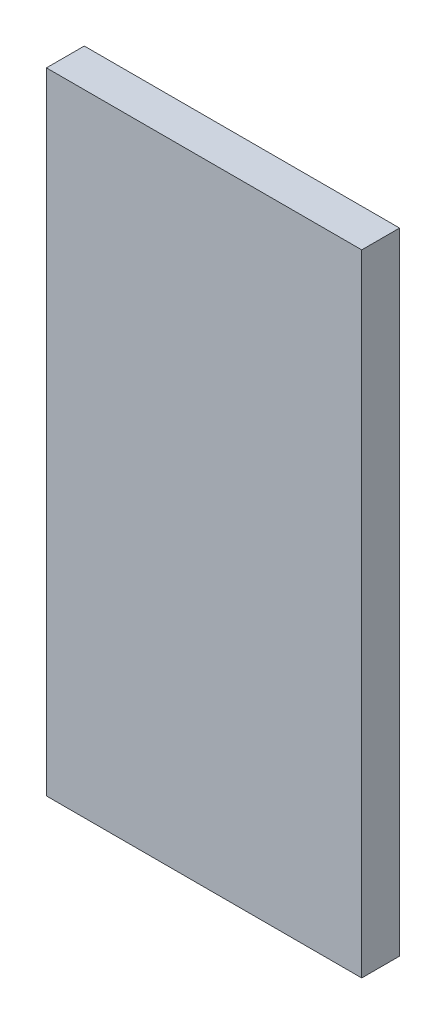
ISO-10303-21;
HEADER;
FILE_DESCRIPTION(('STEP AP214'),'2;1');
FILE_NAME('part.step','',(''),(''),'','','');
FILE_SCHEMA(('AUTOMOTIVE_DESIGN { 1 0 10303 214 1 1 1 1 }'));
ENDSEC;
DATA;
#1=APPLICATION_CONTEXT('core data for automotive mechanical design processes');
#2=APPLICATION_PROTOCOL_DEFINITION('international standard','automotive_design',2000,#1);
#3=PRODUCT_CONTEXT('',#1,'mechanical');
#4=PRODUCT('Part','Part','',(#3));
#5=PRODUCT_RELATED_PRODUCT_CATEGORY('part','',(#4));
#6=PRODUCT_DEFINITION_FORMATION('','',#4);
#7=PRODUCT_DEFINITION_CONTEXT('part definition',#1,'design');
#8=PRODUCT_DEFINITION('design','',#6,#7);
#9=PRODUCT_DEFINITION_SHAPE('','',#8);
#10=(LENGTH_UNIT() NAMED_UNIT(*) SI_UNIT(.MILLI.,.METRE.));
#11=(NAMED_UNIT(*) PLANE_ANGLE_UNIT() SI_UNIT($,.RADIAN.));
#12=(NAMED_UNIT(*) SI_UNIT($,.STERADIAN.) SOLID_ANGLE_UNIT());
#13=UNCERTAINTY_MEASURE_WITH_UNIT(LENGTH_MEASURE(1.E-05),#10,'distance_accuracy_value','');
#14=(GEOMETRIC_REPRESENTATION_CONTEXT(3) GLOBAL_UNCERTAINTY_ASSIGNED_CONTEXT((#13)) GLOBAL_UNIT_ASSIGNED_CONTEXT((#10,
#11,#12)) REPRESENTATION_CONTEXT('',''));
#15=CARTESIAN_POINT('',(0.,0.,0.));
#16=DIRECTION('',(0.,0.,1.));
#17=DIRECTION('',(1.,0.,0.));
#18=AXIS2_PLACEMENT_3D('',#15,#16,#17);
#19=CARTESIAN_POINT('',(101.360466719534,19.7309448170913,1.8));
#20=DIRECTION('',(-1.,0.,0.));
#21=DIRECTION('',(0.,0.,1.));
#22=AXIS2_PLACEMENT_3D('',#19,#20,#21);
#23=PLANE('',#22);
#24=DIRECTION('',(0.,1.,0.));
#25=VECTOR('',#24,1.);
#26=CARTESIAN_POINT('',(101.360466719534,19.7309448170913,0.));
#27=LINE('',#26,#25);
#28=CARTESIAN_POINT('',(101.360466719534,19.7309448170913,0.));
#29=VERTEX_POINT('',#28);
#30=CARTESIAN_POINT('',(101.360466719534,49.7309448170913,0.));
#31=VERTEX_POINT('',#30);
#32=EDGE_CURVE('E95',#29,#31,#27,.T.);
#33=ORIENTED_EDGE('',*,*,#32,.T.);
#34=DIRECTION('',(0.,0.,-1.));
#35=VECTOR('',#34,1.);
#36=CARTESIAN_POINT('',(101.360466719534,49.7309448170913,1.8));
#37=LINE('',#36,#35);
#38=CARTESIAN_POINT('',(101.360466719534,49.7309448170913,1.8));
#39=VERTEX_POINT('',#38);
#40=EDGE_CURVE('E11',#39,#31,#37,.T.);
#41=ORIENTED_EDGE('',*,*,#40,.F.);
#42=DIRECTION('',(0.,1.,0.));
#43=VECTOR('',#42,1.);
#44=CARTESIAN_POINT('',(101.360466719534,19.7309448170913,1.8));
#45=LINE('',#44,#43);
#46=CARTESIAN_POINT('',(101.360466719534,19.7309448170913,1.8));
#47=VERTEX_POINT('',#46);
#48=EDGE_CURVE('E83',#47,#39,#45,.T.);
#49=ORIENTED_EDGE('',*,*,#48,.F.);
#50=DIRECTION('',(0.,0.,-1.));
#51=VECTOR('',#50,1.);
#52=CARTESIAN_POINT('',(101.360466719534,19.7309448170913,1.8));
#53=LINE('',#52,#51);
#54=EDGE_CURVE('E91',#47,#29,#53,.T.);
#55=ORIENTED_EDGE('',*,*,#54,.T.);
#56=EDGE_LOOP('',(#33,#41,#49,#55));
#57=FACE_BOUND('',#56,.T.);
#58=ADVANCED_FACE('F32',(#57),#23,.F.);
#59=CARTESIAN_POINT('',(101.360466719534,49.7309448170913,1.8));
#60=DIRECTION('',(0.,-1.,0.));
#61=DIRECTION('',(0.,0.,-1.));
#62=AXIS2_PLACEMENT_3D('',#59,#60,#61);
#63=PLANE('',#62);
#64=DIRECTION('',(-1.,0.,0.));
#65=VECTOR('',#64,1.);
#66=CARTESIAN_POINT('',(101.360466719534,49.7309448170913,0.));
#67=LINE('',#66,#65);
#68=CARTESIAN_POINT('',(86.3604667195338,49.7309448170913,0.));
#69=VERTEX_POINT('',#68);
#70=EDGE_CURVE('E87',#31,#69,#67,.T.);
#71=ORIENTED_EDGE('',*,*,#70,.T.);
#72=DIRECTION('',(0.,0.,-1.));
#73=VECTOR('',#72,1.);
#74=CARTESIAN_POINT('',(86.3604667195338,49.7309448170913,1.8));
#75=LINE('',#74,#73);
#76=CARTESIAN_POINT('',(86.3604667195338,49.7309448170913,1.8));
#77=VERTEX_POINT('',#76);
#78=EDGE_CURVE('E40',#77,#69,#75,.T.);
#79=ORIENTED_EDGE('',*,*,#78,.F.);
#80=DIRECTION('',(-1.,0.,0.));
#81=VECTOR('',#80,1.);
#82=CARTESIAN_POINT('',(101.360466719534,49.7309448170913,1.8));
#83=LINE('',#82,#81);
#84=EDGE_CURVE('E78',#39,#77,#83,.T.);
#85=ORIENTED_EDGE('',*,*,#84,.F.);
#86=ORIENTED_EDGE('',*,*,#40,.T.);
#87=EDGE_LOOP('',(#71,#79,#85,#86));
#88=FACE_BOUND('',#87,.T.);
#89=ADVANCED_FACE('F86',(#88),#63,.F.);
#90=CARTESIAN_POINT('',(86.3604667195338,19.7309448170913,1.8));
#91=DIRECTION('',(1.,0.,0.));
#92=DIRECTION('',(0.,0.,-1.));
#93=AXIS2_PLACEMENT_3D('',#90,#91,#92);
#94=PLANE('',#93);
#95=DIRECTION('',(0.,-1.,0.));
#96=VECTOR('',#95,1.);
#97=CARTESIAN_POINT('',(86.3604667195338,19.7309448170913,0.));
#98=LINE('',#97,#96);
#99=CARTESIAN_POINT('',(86.3604667195338,19.7309448170913,0.));
#100=VERTEX_POINT('',#99);
#101=EDGE_CURVE('E65',#69,#100,#98,.T.);
#102=ORIENTED_EDGE('',*,*,#101,.T.);
#103=DIRECTION('',(0.,0.,-1.));
#104=VECTOR('',#103,1.);
#105=CARTESIAN_POINT('',(86.3604667195338,19.7309448170913,1.8));
#106=LINE('',#105,#104);
#107=CARTESIAN_POINT('',(86.3604667195338,19.7309448170913,1.8));
#108=VERTEX_POINT('',#107);
#109=EDGE_CURVE('E88',#108,#100,#106,.T.);
#110=ORIENTED_EDGE('',*,*,#109,.F.);
#111=DIRECTION('',(0.,-1.,0.));
#112=VECTOR('',#111,1.);
#113=CARTESIAN_POINT('',(86.3604667195338,19.7309448170913,1.8));
#114=LINE('',#113,#112);
#115=EDGE_CURVE('E81',#77,#108,#114,.T.);
#116=ORIENTED_EDGE('',*,*,#115,.F.);
#117=ORIENTED_EDGE('',*,*,#78,.T.);
#118=EDGE_LOOP('',(#102,#110,#116,#117));
#119=FACE_BOUND('',#118,.T.);
#120=ADVANCED_FACE('F89',(#119),#94,.F.);
#121=CARTESIAN_POINT('',(101.360466719534,19.7309448170913,1.8));
#122=DIRECTION('',(0.,1.,0.));
#123=DIRECTION('',(0.,0.,1.));
#124=AXIS2_PLACEMENT_3D('',#121,#122,#123);
#125=PLANE('',#124);
#126=DIRECTION('',(1.,0.,0.));
#127=VECTOR('',#126,1.);
#128=CARTESIAN_POINT('',(101.360466719534,19.7309448170913,0.));
#129=LINE('',#128,#127);
#130=EDGE_CURVE('E71',#100,#29,#129,.T.);
#131=ORIENTED_EDGE('',*,*,#130,.T.);
#132=ORIENTED_EDGE('',*,*,#54,.F.);
#133=DIRECTION('',(1.,0.,0.));
#134=VECTOR('',#133,1.);
#135=CARTESIAN_POINT('',(101.360466719534,19.7309448170913,1.8));
#136=LINE('',#135,#134);
#137=EDGE_CURVE('E48',#108,#47,#136,.T.);
#138=ORIENTED_EDGE('',*,*,#137,.F.);
#139=ORIENTED_EDGE('',*,*,#109,.T.);
#140=EDGE_LOOP('',(#131,#132,#138,#139));
#141=FACE_BOUND('',#140,.T.);
#142=ADVANCED_FACE('F102',(#141),#125,.F.);
#143=CARTESIAN_POINT('',(0.,0.,1.8));
#144=DIRECTION('',(0.,0.,1.));
#145=DIRECTION('',(1.,0.,0.));
#146=AXIS2_PLACEMENT_3D('',#143,#144,#145);
#147=PLANE('',#146);
#148=ORIENTED_EDGE('',*,*,#48,.T.);
#149=ORIENTED_EDGE('',*,*,#84,.T.);
#150=ORIENTED_EDGE('',*,*,#115,.T.);
#151=ORIENTED_EDGE('',*,*,#137,.T.);
#152=EDGE_LOOP('',(#148,#149,#150,#151));
#153=FACE_BOUND('',#152,.T.);
#154=ADVANCED_FACE('F79',(#153),#147,.T.);
#155=CARTESIAN_POINT('',(0.,0.,0.));
#156=DIRECTION('',(0.,0.,1.));
#157=DIRECTION('',(1.,0.,0.));
#158=AXIS2_PLACEMENT_3D('',#155,#156,#157);
#159=PLANE('',#158);
#160=ORIENTED_EDGE('',*,*,#32,.F.);
#161=ORIENTED_EDGE('',*,*,#130,.F.);
#162=ORIENTED_EDGE('',*,*,#101,.F.);
#163=ORIENTED_EDGE('',*,*,#70,.F.);
#164=EDGE_LOOP('',(#160,#161,#162,#163));
#165=FACE_BOUND('',#164,.T.);
#166=ADVANCED_FACE('F105',(#165),#159,.F.);
#167=CLOSED_SHELL('',(#58,#89,#120,#142,#154,#166));
#168=MANIFOLD_SOLID_BREP('B2',#167);
#169=ADVANCED_BREP_SHAPE_REPRESENTATION('',(#18,#168),#14);
#170=SHAPE_DEFINITION_REPRESENTATION(#9,#169);
ENDSEC;
END-ISO-10303-21;
